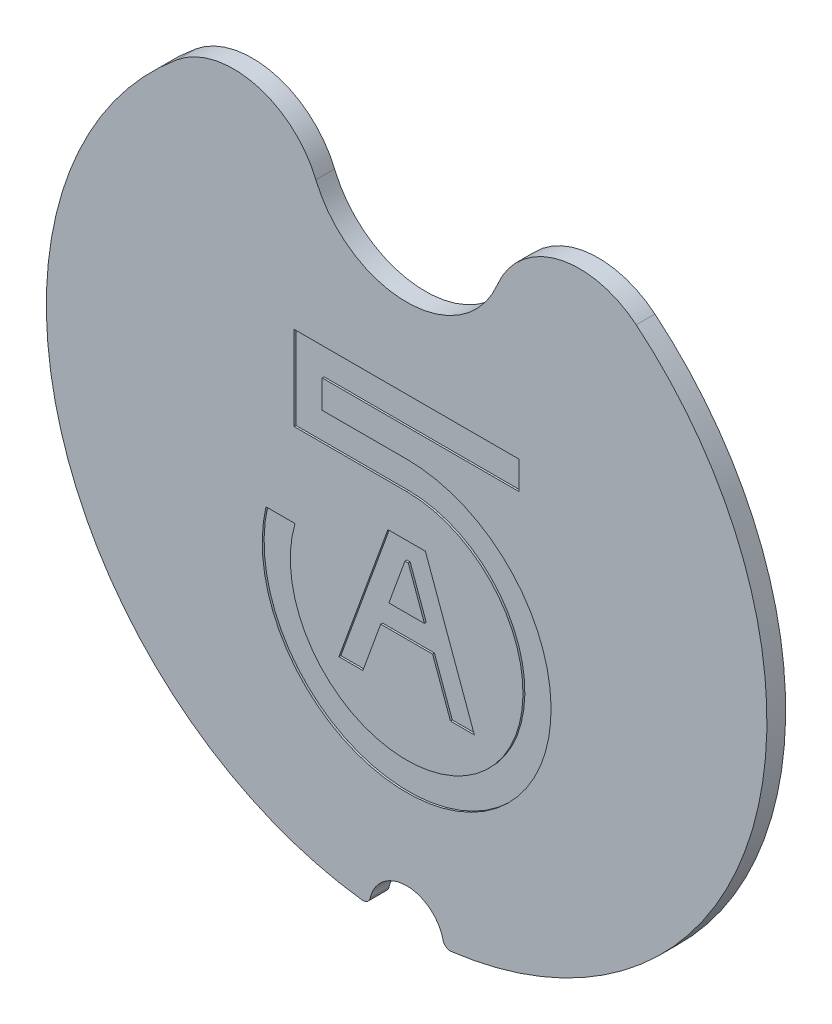
ISO-10303-21;
HEADER;
FILE_DESCRIPTION(('STEP AP214'),'2;1');
FILE_NAME('part.step','',(''),(''),'','','');
FILE_SCHEMA(('AUTOMOTIVE_DESIGN { 1 0 10303 214 1 1 1 1 }'));
ENDSEC;
DATA;
#1=APPLICATION_CONTEXT('core data for automotive mechanical design processes');
#2=APPLICATION_PROTOCOL_DEFINITION('international standard','automotive_design',2000,#1);
#3=PRODUCT_CONTEXT('',#1,'mechanical');
#4=PRODUCT('Part','Part','',(#3));
#5=PRODUCT_RELATED_PRODUCT_CATEGORY('part','',(#4));
#6=PRODUCT_DEFINITION_FORMATION('','',#4);
#7=PRODUCT_DEFINITION_CONTEXT('part definition',#1,'design');
#8=PRODUCT_DEFINITION('design','',#6,#7);
#9=PRODUCT_DEFINITION_SHAPE('','',#8);
#10=(LENGTH_UNIT() NAMED_UNIT(*) SI_UNIT(.MILLI.,.METRE.));
#11=(NAMED_UNIT(*) PLANE_ANGLE_UNIT() SI_UNIT($,.RADIAN.));
#12=(NAMED_UNIT(*) SI_UNIT($,.STERADIAN.) SOLID_ANGLE_UNIT());
#13=UNCERTAINTY_MEASURE_WITH_UNIT(LENGTH_MEASURE(1.E-05),#10,'distance_accuracy_value','');
#14=(GEOMETRIC_REPRESENTATION_CONTEXT(3) GLOBAL_UNCERTAINTY_ASSIGNED_CONTEXT((#13)) GLOBAL_UNIT_ASSIGNED_CONTEXT((#10,
#11,#12)) REPRESENTATION_CONTEXT('',''));
#15=CARTESIAN_POINT('',(0.,0.,0.));
#16=DIRECTION('',(0.,0.,1.));
#17=DIRECTION('',(1.,0.,0.));
#18=AXIS2_PLACEMENT_3D('',#15,#16,#17);
#19=CARTESIAN_POINT('',(46.1977745676131,55.875,5.));
#20=DIRECTION('',(0.,0.,-1.));
#21=DIRECTION('',(-1.,0.,0.));
#22=AXIS2_PLACEMENT_3D('',#19,#20,#21);
#23=CYLINDRICAL_SURFACE('',#22,23.75);
#24=CARTESIAN_POINT('',(46.1977745676131,55.875,0.));
#25=DIRECTION('',(0.,0.,1.));
#26=DIRECTION('',(1.,0.,0.));
#27=AXIS2_PLACEMENT_3D('',#24,#25,#26);
#28=CIRCLE('',#27,23.75);
#29=CARTESIAN_POINT('',(61.3315283052795,74.1788793103448,0.));
#30=VERTEX_POINT('',#29);
#31=CARTESIAN_POINT('',(24.2538316479969,64.959375,0.));
#32=VERTEX_POINT('',#31);
#33=EDGE_CURVE('E328',#30,#32,#28,.T.);
#34=ORIENTED_EDGE('',*,*,#33,.T.);
#35=DIRECTION('',(0.,0.,-1.));
#36=VECTOR('',#35,1.);
#37=CARTESIAN_POINT('',(24.2538316479969,64.959375,5.));
#38=LINE('',#37,#36);
#39=CARTESIAN_POINT('',(24.2538316479969,64.959375,5.));
#40=VERTEX_POINT('',#39);
#41=EDGE_CURVE('E383',#40,#32,#38,.T.);
#42=ORIENTED_EDGE('',*,*,#41,.F.);
#43=CARTESIAN_POINT('',(46.1977745676131,55.875,5.));
#44=DIRECTION('',(0.,0.,1.));
#45=DIRECTION('',(1.,0.,0.));
#46=AXIS2_PLACEMENT_3D('',#43,#44,#45);
#47=CIRCLE('',#46,23.75);
#48=CARTESIAN_POINT('',(61.3315283052795,74.1788793103448,5.));
#49=VERTEX_POINT('',#48);
#50=EDGE_CURVE('E347',#49,#40,#47,.T.);
#51=ORIENTED_EDGE('',*,*,#50,.F.);
#52=DIRECTION('',(0.,0.,-1.));
#53=VECTOR('',#52,1.);
#54=CARTESIAN_POINT('',(61.3315283052795,74.1788793103448,5.));
#55=LINE('',#54,#53);
#56=EDGE_CURVE('E362',#49,#30,#55,.T.);
#57=ORIENTED_EDGE('',*,*,#56,.T.);
#58=EDGE_LOOP('',(#34,#42,#51,#57));
#59=FACE_BOUND('',#58,.T.);
#60=ADVANCED_FACE('F37',(#59),#23,.T.);
#61=CARTESIAN_POINT('',(0.,75.,5.));
#62=DIRECTION('',(0.,0.,-1.));
#63=DIRECTION('',(-1.,0.,0.));
#64=AXIS2_PLACEMENT_3D('',#61,#62,#63);
#65=CYLINDRICAL_SURFACE('',#64,26.25);
#66=CARTESIAN_POINT('',(0.,75.,0.));
#67=DIRECTION('',(0.,0.,-1.));
#68=DIRECTION('',(1.,0.,0.));
#69=AXIS2_PLACEMENT_3D('',#66,#67,#68);
#70=CIRCLE('',#69,26.25);
#71=CARTESIAN_POINT('',(-24.2538316479969,64.959375,0.));
#72=VERTEX_POINT('',#71);
#73=EDGE_CURVE('E365',#32,#72,#70,.T.);
#74=ORIENTED_EDGE('',*,*,#73,.T.);
#75=DIRECTION('',(0.,0.,-1.));
#76=VECTOR('',#75,1.);
#77=CARTESIAN_POINT('',(-24.2538316479969,64.959375,5.));
#78=LINE('',#77,#76);
#79=CARTESIAN_POINT('',(-24.2538316479969,64.959375,5.));
#80=VERTEX_POINT('',#79);
#81=EDGE_CURVE('E380',#80,#72,#78,.T.);
#82=ORIENTED_EDGE('',*,*,#81,.F.);
#83=CARTESIAN_POINT('',(0.,75.,5.));
#84=DIRECTION('',(0.,0.,-1.));
#85=DIRECTION('',(1.,0.,0.));
#86=AXIS2_PLACEMENT_3D('',#83,#84,#85);
#87=CIRCLE('',#86,26.25);
#88=EDGE_CURVE('E350',#40,#80,#87,.T.);
#89=ORIENTED_EDGE('',*,*,#88,.F.);
#90=ORIENTED_EDGE('',*,*,#41,.T.);
#91=EDGE_LOOP('',(#74,#82,#89,#90));
#92=FACE_BOUND('',#91,.T.);
#93=ADVANCED_FACE('F422',(#92),#65,.F.);
#94=CARTESIAN_POINT('',(-46.1977745676131,55.875,5.));
#95=DIRECTION('',(0.,0.,-1.));
#96=DIRECTION('',(-1.,0.,0.));
#97=AXIS2_PLACEMENT_3D('',#94,#95,#96);
#98=CYLINDRICAL_SURFACE('',#97,23.75);
#99=CARTESIAN_POINT('',(-46.1977745676131,55.875,0.));
#100=DIRECTION('',(0.,0.,1.));
#101=DIRECTION('',(1.,0.,0.));
#102=AXIS2_PLACEMENT_3D('',#99,#100,#101);
#103=CIRCLE('',#102,23.75);
#104=CARTESIAN_POINT('',(-61.3315283052795,74.1788793103448,0.));
#105=VERTEX_POINT('',#104);
#106=EDGE_CURVE('E367',#72,#105,#103,.T.);
#107=ORIENTED_EDGE('',*,*,#106,.T.);
#108=DIRECTION('',(0.,0.,-1.));
#109=VECTOR('',#108,1.);
#110=CARTESIAN_POINT('',(-61.3315283052795,74.1788793103448,5.));
#111=LINE('',#110,#109);
#112=CARTESIAN_POINT('',(-61.3315283052795,74.1788793103448,5.));
#113=VERTEX_POINT('',#112);
#114=EDGE_CURVE('E377',#113,#105,#111,.T.);
#115=ORIENTED_EDGE('',*,*,#114,.F.);
#116=CARTESIAN_POINT('',(-46.1977745676131,55.875,5.));
#117=DIRECTION('',(0.,0.,1.));
#118=DIRECTION('',(1.,0.,0.));
#119=AXIS2_PLACEMENT_3D('',#116,#117,#118);
#120=CIRCLE('',#119,23.75);
#121=EDGE_CURVE('E353',#80,#113,#120,.T.);
#122=ORIENTED_EDGE('',*,*,#121,.F.);
#123=ORIENTED_EDGE('',*,*,#81,.T.);
#124=EDGE_LOOP('',(#107,#115,#122,#123));
#125=FACE_BOUND('',#124,.T.);
#126=ADVANCED_FACE('F427',(#125),#98,.T.);
#127=CARTESIAN_POINT('',(0.,0.,5.));
#128=DIRECTION('',(0.,0.,-1.));
#129=DIRECTION('',(-1.,0.,0.));
#130=AXIS2_PLACEMENT_3D('',#127,#128,#129);
#131=CYLINDRICAL_SURFACE('',#130,96.25);
#132=CARTESIAN_POINT('',(0.,0.,0.));
#133=DIRECTION('',(0.,0.,1.));
#134=DIRECTION('',(1.,0.,0.));
#135=AXIS2_PLACEMENT_3D('',#132,#133,#134);
#136=CIRCLE('',#135,96.25);
#137=CARTESIAN_POINT('',(-11.9339520158674,-95.5072944297082,0.));
#138=VERTEX_POINT('',#137);
#139=EDGE_CURVE('E369',#105,#138,#136,.T.);
#140=ORIENTED_EDGE('',*,*,#139,.T.);
#141=DIRECTION('',(0.,0.,-1.));
#142=VECTOR('',#141,1.);
#143=CARTESIAN_POINT('',(-11.9339520158674,-95.5072944297083,5.));
#144=LINE('',#143,#142);
#145=CARTESIAN_POINT('',(-11.9339520158674,-95.5072944297082,5.));
#146=VERTEX_POINT('',#145);
#147=EDGE_CURVE('E391',#138,#146,#144,.F.);
#148=ORIENTED_EDGE('',*,*,#147,.T.);
#149=CARTESIAN_POINT('',(0.,0.,5.));
#150=DIRECTION('',(0.,0.,1.));
#151=DIRECTION('',(1.,0.,0.));
#152=AXIS2_PLACEMENT_3D('',#149,#150,#151);
#153=CIRCLE('',#152,96.25);
#154=EDGE_CURVE('E355',#113,#146,#153,.T.);
#155=ORIENTED_EDGE('',*,*,#154,.F.);
#156=ORIENTED_EDGE('',*,*,#114,.T.);
#157=EDGE_LOOP('',(#140,#148,#155,#156));
#158=FACE_BOUND('',#157,.T.);
#159=ADVANCED_FACE('F433',(#158),#131,.T.);
#160=CARTESIAN_POINT('',(0.,-96.25,5.));
#161=DIRECTION('',(0.,0.,-1.));
#162=DIRECTION('',(-1.,0.,0.));
#163=AXIS2_PLACEMENT_3D('',#160,#161,#162);
#164=CYLINDRICAL_SURFACE('',#163,9.99999999999999);
#165=CARTESIAN_POINT('',(0.,-96.25,0.));
#166=DIRECTION('',(0.,0.,-1.));
#167=DIRECTION('',(1.,0.,0.));
#168=AXIS2_PLACEMENT_3D('',#165,#166,#167);
#169=CIRCLE('',#168,9.99999999999999);
#170=CARTESIAN_POINT('',(-9.73831149346754,-93.9772727272727,0.));
#171=VERTEX_POINT('',#170);
#172=CARTESIAN_POINT('',(9.73831149346751,-93.9772727272727,0.));
#173=VERTEX_POINT('',#172);
#174=EDGE_CURVE('E372',#171,#173,#169,.T.);
#175=ORIENTED_EDGE('',*,*,#174,.T.);
#176=DIRECTION('',(0.,0.,-1.));
#177=VECTOR('',#176,1.);
#178=CARTESIAN_POINT('',(9.73831149346751,-93.9772727272727,5.));
#179=LINE('',#178,#177);
#180=CARTESIAN_POINT('',(9.73831149346751,-93.9772727272727,5.));
#181=VERTEX_POINT('',#180);
#182=EDGE_CURVE('E45',#173,#181,#179,.F.);
#183=ORIENTED_EDGE('',*,*,#182,.T.);
#184=CARTESIAN_POINT('',(0.,-96.25,5.));
#185=DIRECTION('',(0.,0.,-1.));
#186=DIRECTION('',(1.,0.,0.));
#187=AXIS2_PLACEMENT_3D('',#184,#185,#186);
#188=CIRCLE('',#187,9.99999999999999);
#189=CARTESIAN_POINT('',(-9.73831149346754,-93.9772727272727,5.));
#190=VERTEX_POINT('',#189);
#191=EDGE_CURVE('E358',#190,#181,#188,.T.);
#192=ORIENTED_EDGE('',*,*,#191,.F.);
#193=DIRECTION('',(0.,0.,-1.));
#194=VECTOR('',#193,1.);
#195=CARTESIAN_POINT('',(-9.73831149346754,-93.9772727272727,5.));
#196=LINE('',#195,#194);
#197=EDGE_CURVE('E386',#190,#171,#196,.T.);
#198=ORIENTED_EDGE('',*,*,#197,.T.);
#199=EDGE_LOOP('',(#175,#183,#192,#198));
#200=FACE_BOUND('',#199,.T.);
#201=ADVANCED_FACE('F437',(#200),#164,.F.);
#202=CARTESIAN_POINT('',(0.,0.,5.));
#203=DIRECTION('',(0.,0.,-1.));
#204=DIRECTION('',(-1.,0.,0.));
#205=AXIS2_PLACEMENT_3D('',#202,#203,#204);
#206=CYLINDRICAL_SURFACE('',#205,96.25);
#207=CARTESIAN_POINT('',(0.,0.,5.));
#208=DIRECTION('',(0.,0.,1.));
#209=DIRECTION('',(1.,0.,0.));
#210=AXIS2_PLACEMENT_3D('',#207,#208,#209);
#211=CIRCLE('',#210,96.25);
#212=CARTESIAN_POINT('',(11.9339520158674,-95.5072944297082,5.));
#213=VERTEX_POINT('',#212);
#214=EDGE_CURVE('E360',#213,#49,#211,.T.);
#215=ORIENTED_EDGE('',*,*,#214,.F.);
#216=DIRECTION('',(0.,0.,-1.));
#217=VECTOR('',#216,1.);
#218=CARTESIAN_POINT('',(11.9339520158674,-95.5072944297082,5.));
#219=LINE('',#218,#217);
#220=CARTESIAN_POINT('',(11.9339520158674,-95.5072944297082,0.));
#221=VERTEX_POINT('',#220);
#222=EDGE_CURVE('E395',#213,#221,#219,.T.);
#223=ORIENTED_EDGE('',*,*,#222,.T.);
#224=CARTESIAN_POINT('',(0.,0.,0.));
#225=DIRECTION('',(0.,0.,1.));
#226=DIRECTION('',(1.,0.,0.));
#227=AXIS2_PLACEMENT_3D('',#224,#225,#226);
#228=CIRCLE('',#227,96.25);
#229=EDGE_CURVE('E351',#221,#30,#228,.T.);
#230=ORIENTED_EDGE('',*,*,#229,.T.);
#231=ORIENTED_EDGE('',*,*,#56,.F.);
#232=EDGE_LOOP('',(#215,#223,#230,#231));
#233=FACE_BOUND('',#232,.T.);
#234=ADVANCED_FACE('F401',(#233),#206,.T.);
#235=CARTESIAN_POINT('',(23.0988872838066,65.4375,5.));
#236=DIRECTION('',(0.,0.,1.));
#237=DIRECTION('',(1.,0.,0.));
#238=AXIS2_PLACEMENT_3D('',#235,#236,#237);
#239=PLANE('',#238);
#240=DIRECTION('',(-0.342020143325672,-0.939692620785907,0.));
#241=VECTOR('',#240,1.);
#242=CARTESIAN_POINT('',(-5.00000000000001,-6.35531276771627,5.));
#243=LINE('',#242,#241);
#244=CARTESIAN_POINT('',(-5.00000000000001,-6.35531276771627,5.));
#245=VERTEX_POINT('',#244);
#246=CARTESIAN_POINT('',(-18.0837849605956,-42.3027165079522,5.));
#247=VERTEX_POINT('',#246);
#248=EDGE_CURVE('E540',#245,#247,#243,.T.);
#249=ORIENTED_EDGE('',*,*,#248,.F.);
#250=DIRECTION('',(-1.,0.,0.));
#251=VECTOR('',#250,1.);
#252=CARTESIAN_POINT('',(-5.00000000000001,-6.35531276771627,5.));
#253=LINE('',#252,#251);
#254=CARTESIAN_POINT('',(4.99999999999999,-6.35531276771627,5.));
#255=VERTEX_POINT('',#254);
#256=EDGE_CURVE('E589',#255,#245,#253,.T.);
#257=ORIENTED_EDGE('',*,*,#256,.F.);
#258=DIRECTION('',(-0.342020143325672,0.939692620785907,0.));
#259=VECTOR('',#258,1.);
#260=CARTESIAN_POINT('',(4.99999999999999,-6.35531276771627,5.));
#261=LINE('',#260,#259);
#262=CARTESIAN_POINT('',(18.0837849605956,-42.3027165079522,5.));
#263=VERTEX_POINT('',#262);
#264=EDGE_CURVE('E877',#263,#255,#261,.T.);
#265=ORIENTED_EDGE('',*,*,#264,.F.);
#266=DIRECTION('',(1.,0.,0.));
#267=VECTOR('',#266,1.);
#268=CARTESIAN_POINT('',(18.0837849605956,-42.3027165079522,5.));
#269=LINE('',#268,#267);
#270=CARTESIAN_POINT('',(11.6987183257401,-42.3027165079522,5.));
#271=VERTEX_POINT('',#270);
#272=EDGE_CURVE('E880',#271,#263,#269,.T.);
#273=ORIENTED_EDGE('',*,*,#272,.F.);
#274=DIRECTION('',(0.342020143325674,-0.939692620785907,0.));
#275=VECTOR('',#274,1.);
#276=CARTESIAN_POINT('',(11.6987183257401,-42.3027165079522,5.));
#277=LINE('',#276,#275);
#278=CARTESIAN_POINT('',(6.92852647245066,-29.1967221045732,5.));
#279=VERTEX_POINT('',#278);
#280=EDGE_CURVE('E887',#279,#271,#277,.T.);
#281=ORIENTED_EDGE('',*,*,#280,.F.);
#282=DIRECTION('',(1.,0.,0.));
#283=VECTOR('',#282,1.);
#284=CARTESIAN_POINT('',(-6.92852647245068,-29.1967221045732,5.));
#285=LINE('',#284,#283);
#286=CARTESIAN_POINT('',(-6.92852647245068,-29.1967221045732,5.));
#287=VERTEX_POINT('',#286);
#288=EDGE_CURVE('E565',#287,#279,#285,.T.);
#289=ORIENTED_EDGE('',*,*,#288,.F.);
#290=DIRECTION('',(0.342020143325672,0.939692620785907,0.));
#291=VECTOR('',#290,1.);
#292=CARTESIAN_POINT('',(-11.6987183257401,-42.3027165079522,5.));
#293=LINE('',#292,#291);
#294=CARTESIAN_POINT('',(-11.6987183257401,-42.3027165079522,5.));
#295=VERTEX_POINT('',#294);
#296=EDGE_CURVE('E563',#295,#287,#293,.T.);
#297=ORIENTED_EDGE('',*,*,#296,.F.);
#298=DIRECTION('',(1.,0.,0.));
#299=VECTOR('',#298,1.);
#300=CARTESIAN_POINT('',(-18.0837849605956,-42.3027165079522,5.));
#301=LINE('',#300,#299);
#302=EDGE_CURVE('E550',#247,#295,#301,.T.);
#303=ORIENTED_EDGE('',*,*,#302,.F.);
#304=EDGE_LOOP('',(#249,#257,#265,#273,#281,#289,#297,#303));
#305=FACE_BOUND('',#304,.T.);
#306=DIRECTION('',(0.,1.,0.));
#307=VECTOR('',#306,1.);
#308=CARTESIAN_POINT('',(30.0605601779389,27.4545081535052,5.));
#309=LINE('',#308,#307);
#310=CARTESIAN_POINT('',(30.0605601779389,19.9545081535052,5.));
#311=VERTEX_POINT('',#310);
#312=CARTESIAN_POINT('',(30.0605601779389,27.4545081535052,5.));
#313=VERTEX_POINT('',#312);
#314=EDGE_CURVE('E297',#311,#313,#309,.T.);
#315=ORIENTED_EDGE('',*,*,#314,.F.);
#316=DIRECTION('',(1.,0.,0.));
#317=VECTOR('',#316,1.);
#318=CARTESIAN_POINT('',(30.0605601779389,19.9545081535052,5.));
#319=LINE('',#318,#317);
#320=CARTESIAN_POINT('',(-22.5605601779389,19.9545081535052,5.));
#321=VERTEX_POINT('',#320);
#322=EDGE_CURVE('E269',#321,#311,#319,.T.);
#323=ORIENTED_EDGE('',*,*,#322,.F.);
#324=DIRECTION('',(0.,1.,0.));
#325=VECTOR('',#324,1.);
#326=CARTESIAN_POINT('',(-22.5605601779389,19.9545081535052,5.));
#327=LINE('',#326,#325);
#328=CARTESIAN_POINT('',(-22.5605601779389,12.4545081535052,5.));
#329=VERTEX_POINT('',#328);
#330=EDGE_CURVE('E321',#329,#321,#327,.T.);
#331=ORIENTED_EDGE('',*,*,#330,.F.);
#332=DIRECTION('',(-1.,0.,0.));
#333=VECTOR('',#332,1.);
#334=CARTESIAN_POINT('',(-22.5605601779389,12.4545081535052,5.));
#335=LINE('',#334,#333);
#336=CARTESIAN_POINT('',(0.,12.4545081535052,5.));
#337=VERTEX_POINT('',#336);
#338=EDGE_CURVE('E318',#337,#329,#335,.T.);
#339=ORIENTED_EDGE('',*,*,#338,.F.);
#340=CARTESIAN_POINT('',(0.,-26.1251014973369,5.));
#341=DIRECTION('',(0.,0.,1.));
#342=DIRECTION('',(-1.,0.,0.));
#343=AXIS2_PLACEMENT_3D('',#340,#341,#342);
#344=CIRCLE('',#343,38.5796096508421);
#345=CARTESIAN_POINT('',(-37.5718466988546,-17.3648151750118,5.));
#346=VERTEX_POINT('',#345);
#347=EDGE_CURVE('E315',#346,#337,#344,.T.);
#348=ORIENTED_EDGE('',*,*,#347,.F.);
#349=DIRECTION('',(-1.,0.,0.));
#350=VECTOR('',#349,1.);
#351=CARTESIAN_POINT('',(-37.5718466988546,-17.3648151750118,5.));
#352=LINE('',#351,#350);
#353=CARTESIAN_POINT('',(-29.8194486803428,-17.3648151750118,5.));
#354=VERTEX_POINT('',#353);
#355=EDGE_CURVE('E312',#354,#346,#352,.T.);
#356=ORIENTED_EDGE('',*,*,#355,.F.);
#357=CARTESIAN_POINT('',(0.,-26.1251014973369,5.));
#358=DIRECTION('',(0.,0.,-1.));
#359=DIRECTION('',(1.,0.,0.));
#360=AXIS2_PLACEMENT_3D('',#357,#358,#359);
#361=CIRCLE('',#360,31.0796096508421);
#362=CARTESIAN_POINT('',(0.,4.95450815350518,5.));
#363=VERTEX_POINT('',#362);
#364=EDGE_CURVE('E309',#363,#354,#361,.T.);
#365=ORIENTED_EDGE('',*,*,#364,.F.);
#366=DIRECTION('',(1.,0.,0.));
#367=VECTOR('',#366,1.);
#368=CARTESIAN_POINT('',(0.,4.95450815350518,5.));
#369=LINE('',#368,#367);
#370=CARTESIAN_POINT('',(-30.0605601779389,4.95450815350517,5.));
#371=VERTEX_POINT('',#370);
#372=EDGE_CURVE('E306',#371,#363,#369,.T.);
#373=ORIENTED_EDGE('',*,*,#372,.F.);
#374=DIRECTION('',(0.,-1.,0.));
#375=VECTOR('',#374,1.);
#376=CARTESIAN_POINT('',(-30.0605601779389,27.4545081535052,5.));
#377=LINE('',#376,#375);
#378=CARTESIAN_POINT('',(-30.0605601779389,27.4545081535052,5.));
#379=VERTEX_POINT('',#378);
#380=EDGE_CURVE('E303',#379,#371,#377,.T.);
#381=ORIENTED_EDGE('',*,*,#380,.F.);
#382=DIRECTION('',(-1.,0.,0.));
#383=VECTOR('',#382,1.);
#384=CARTESIAN_POINT('',(30.0605601779389,27.4545081535052,5.));
#385=LINE('',#384,#383);
#386=EDGE_CURVE('E299',#313,#379,#385,.T.);
#387=ORIENTED_EDGE('',*,*,#386,.F.);
#388=EDGE_LOOP('',(#315,#323,#331,#339,#348,#356,#365,#373,#381,#387));
#389=FACE_BOUND('',#388,.T.);
#390=ORIENTED_EDGE('',*,*,#191,.T.);
#391=CARTESIAN_POINT('',(11.6859737921611,-93.5227272727273,5.));
#392=DIRECTION('',(0.,0.,1.));
#393=DIRECTION('',(1.,0.,0.));
#394=AXIS2_PLACEMENT_3D('',#391,#392,#393);
#395=CIRCLE('',#394,2.);
#396=EDGE_CURVE('E11',#181,#213,#395,.T.);
#397=ORIENTED_EDGE('',*,*,#396,.T.);
#398=ORIENTED_EDGE('',*,*,#214,.T.);
#399=ORIENTED_EDGE('',*,*,#50,.T.);
#400=ORIENTED_EDGE('',*,*,#88,.T.);
#401=ORIENTED_EDGE('',*,*,#121,.T.);
#402=ORIENTED_EDGE('',*,*,#154,.T.);
#403=CARTESIAN_POINT('',(-11.685973792161,-93.5227272727273,5.));
#404=DIRECTION('',(0.,0.,1.));
#405=DIRECTION('',(1.,0.,0.));
#406=AXIS2_PLACEMENT_3D('',#403,#404,#405);
#407=CIRCLE('',#406,2.);
#408=EDGE_CURVE('E393',#146,#190,#407,.T.);
#409=ORIENTED_EDGE('',*,*,#408,.T.);
#410=EDGE_LOOP('',(#390,#397,#398,#399,#400,#401,#402,#409));
#411=FACE_BOUND('',#410,.T.);
#412=ADVANCED_FACE('F412',(#305,#389,#411),#239,.T.);
#413=CARTESIAN_POINT('',(23.0988872838066,65.4375,0.));
#414=DIRECTION('',(0.,0.,1.));
#415=DIRECTION('',(1.,0.,0.));
#416=AXIS2_PLACEMENT_3D('',#413,#414,#415);
#417=PLANE('',#416);
#418=ORIENTED_EDGE('',*,*,#229,.F.);
#419=CARTESIAN_POINT('',(11.6859737921611,-93.5227272727273,0.));
#420=DIRECTION('',(0.,0.,1.));
#421=DIRECTION('',(1.,0.,0.));
#422=AXIS2_PLACEMENT_3D('',#419,#420,#421);
#423=CIRCLE('',#422,2.);
#424=EDGE_CURVE('E59',#221,#173,#423,.F.);
#425=ORIENTED_EDGE('',*,*,#424,.T.);
#426=ORIENTED_EDGE('',*,*,#174,.F.);
#427=CARTESIAN_POINT('',(-11.685973792161,-93.5227272727273,0.));
#428=DIRECTION('',(0.,0.,1.));
#429=DIRECTION('',(1.,0.,0.));
#430=AXIS2_PLACEMENT_3D('',#427,#428,#429);
#431=CIRCLE('',#430,2.);
#432=EDGE_CURVE('E389',#171,#138,#431,.F.);
#433=ORIENTED_EDGE('',*,*,#432,.T.);
#434=ORIENTED_EDGE('',*,*,#139,.F.);
#435=ORIENTED_EDGE('',*,*,#106,.F.);
#436=ORIENTED_EDGE('',*,*,#73,.F.);
#437=ORIENTED_EDGE('',*,*,#33,.F.);
#438=EDGE_LOOP('',(#418,#425,#426,#433,#434,#435,#436,#437));
#439=FACE_BOUND('',#438,.T.);
#440=ADVANCED_FACE('F406',(#439),#417,.F.);
#441=CARTESIAN_POINT('',(30.0605601779389,27.4545081535052,4.5));
#442=DIRECTION('',(1.,0.,0.));
#443=DIRECTION('',(0.,1.,0.));
#444=AXIS2_PLACEMENT_3D('',#441,#442,#443);
#445=PLANE('',#444);
#446=ORIENTED_EDGE('',*,*,#314,.T.);
#447=DIRECTION('',(0.,0.,1.));
#448=VECTOR('',#447,1.);
#449=CARTESIAN_POINT('',(30.0605601779389,27.4545081535052,4.5));
#450=LINE('',#449,#448);
#451=CARTESIAN_POINT('',(30.0605601779389,27.4545081535052,4.5));
#452=VERTEX_POINT('',#451);
#453=EDGE_CURVE('E296',#452,#313,#450,.T.);
#454=ORIENTED_EDGE('',*,*,#453,.F.);
#455=DIRECTION('',(0.,1.,0.));
#456=VECTOR('',#455,1.);
#457=CARTESIAN_POINT('',(30.0605601779389,27.4545081535052,4.5));
#458=LINE('',#457,#456);
#459=CARTESIAN_POINT('',(30.0605601779389,19.9545081535052,4.5));
#460=VERTEX_POINT('',#459);
#461=EDGE_CURVE('E265',#460,#452,#458,.T.);
#462=ORIENTED_EDGE('',*,*,#461,.F.);
#463=DIRECTION('',(0.,0.,1.));
#464=VECTOR('',#463,1.);
#465=CARTESIAN_POINT('',(30.0605601779389,19.9545081535052,4.5));
#466=LINE('',#465,#464);
#467=EDGE_CURVE('E326',#460,#311,#466,.T.);
#468=ORIENTED_EDGE('',*,*,#467,.T.);
#469=EDGE_LOOP('',(#446,#454,#462,#468));
#470=FACE_BOUND('',#469,.T.);
#471=ADVANCED_FACE('F445',(#470),#445,.F.);
#472=CARTESIAN_POINT('',(30.0605601779389,19.9545081535052,4.5));
#473=DIRECTION('',(0.,-1.,0.));
#474=DIRECTION('',(1.,0.,0.));
#475=AXIS2_PLACEMENT_3D('',#472,#473,#474);
#476=PLANE('',#475);
#477=ORIENTED_EDGE('',*,*,#322,.T.);
#478=ORIENTED_EDGE('',*,*,#467,.F.);
#479=DIRECTION('',(1.,0.,0.));
#480=VECTOR('',#479,1.);
#481=CARTESIAN_POINT('',(30.0605601779389,19.9545081535052,4.5));
#482=LINE('',#481,#480);
#483=CARTESIAN_POINT('',(-22.5605601779389,19.9545081535052,4.5));
#484=VERTEX_POINT('',#483);
#485=EDGE_CURVE('E293',#484,#460,#482,.T.);
#486=ORIENTED_EDGE('',*,*,#485,.F.);
#487=DIRECTION('',(0.,0.,1.));
#488=VECTOR('',#487,1.);
#489=CARTESIAN_POINT('',(-22.5605601779389,19.9545081535052,4.5));
#490=LINE('',#489,#488);
#491=EDGE_CURVE('E329',#484,#321,#490,.T.);
#492=ORIENTED_EDGE('',*,*,#491,.T.);
#493=EDGE_LOOP('',(#477,#478,#486,#492));
#494=FACE_BOUND('',#493,.T.);
#495=ADVANCED_FACE('F451',(#494),#476,.F.);
#496=CARTESIAN_POINT('',(-22.5605601779389,19.9545081535052,4.5));
#497=DIRECTION('',(1.,0.,0.));
#498=DIRECTION('',(0.,0.,-1.));
#499=AXIS2_PLACEMENT_3D('',#496,#497,#498);
#500=PLANE('',#499);
#501=ORIENTED_EDGE('',*,*,#330,.T.);
#502=ORIENTED_EDGE('',*,*,#491,.F.);
#503=DIRECTION('',(0.,1.,0.));
#504=VECTOR('',#503,1.);
#505=CARTESIAN_POINT('',(-22.5605601779389,19.9545081535052,4.5));
#506=LINE('',#505,#504);
#507=CARTESIAN_POINT('',(-22.5605601779389,12.4545081535052,4.5));
#508=VERTEX_POINT('',#507);
#509=EDGE_CURVE('E290',#508,#484,#506,.T.);
#510=ORIENTED_EDGE('',*,*,#509,.F.);
#511=DIRECTION('',(0.,0.,1.));
#512=VECTOR('',#511,1.);
#513=CARTESIAN_POINT('',(-22.5605601779389,12.4545081535052,4.5));
#514=LINE('',#513,#512);
#515=EDGE_CURVE('E331',#508,#329,#514,.T.);
#516=ORIENTED_EDGE('',*,*,#515,.T.);
#517=EDGE_LOOP('',(#501,#502,#510,#516));
#518=FACE_BOUND('',#517,.T.);
#519=ADVANCED_FACE('F481',(#518),#500,.F.);
#520=CARTESIAN_POINT('',(-22.5605601779389,12.4545081535052,4.5));
#521=DIRECTION('',(0.,1.,0.));
#522=DIRECTION('',(-1.,0.,0.));
#523=AXIS2_PLACEMENT_3D('',#520,#521,#522);
#524=PLANE('',#523);
#525=ORIENTED_EDGE('',*,*,#338,.T.);
#526=ORIENTED_EDGE('',*,*,#515,.F.);
#527=DIRECTION('',(-1.,0.,0.));
#528=VECTOR('',#527,1.);
#529=CARTESIAN_POINT('',(-22.5605601779389,12.4545081535052,4.5));
#530=LINE('',#529,#528);
#531=CARTESIAN_POINT('',(0.,12.4545081535052,4.5));
#532=VERTEX_POINT('',#531);
#533=EDGE_CURVE('E287',#532,#508,#530,.T.);
#534=ORIENTED_EDGE('',*,*,#533,.F.);
#535=DIRECTION('',(0.,0.,1.));
#536=VECTOR('',#535,1.);
#537=CARTESIAN_POINT('',(0.,12.4545081535052,4.5));
#538=LINE('',#537,#536);
#539=EDGE_CURVE('E333',#532,#337,#538,.T.);
#540=ORIENTED_EDGE('',*,*,#539,.T.);
#541=EDGE_LOOP('',(#525,#526,#534,#540));
#542=FACE_BOUND('',#541,.T.);
#543=ADVANCED_FACE('F477',(#542),#524,.F.);
#544=CARTESIAN_POINT('',(0.,-26.1251014973369,4.5));
#545=DIRECTION('',(0.,0.,1.));
#546=DIRECTION('',(1.,0.,0.));
#547=AXIS2_PLACEMENT_3D('',#544,#545,#546);
#548=CYLINDRICAL_SURFACE('',#547,38.5796096508421);
#549=ORIENTED_EDGE('',*,*,#347,.T.);
#550=ORIENTED_EDGE('',*,*,#539,.F.);
#551=CARTESIAN_POINT('',(0.,-26.1251014973369,4.5));
#552=DIRECTION('',(0.,0.,1.));
#553=DIRECTION('',(-1.,0.,0.));
#554=AXIS2_PLACEMENT_3D('',#551,#552,#553);
#555=CIRCLE('',#554,38.5796096508421);
#556=CARTESIAN_POINT('',(-37.5718466988546,-17.3648151750118,4.5));
#557=VERTEX_POINT('',#556);
#558=EDGE_CURVE('E284',#557,#532,#555,.T.);
#559=ORIENTED_EDGE('',*,*,#558,.F.);
#560=DIRECTION('',(0.,0.,1.));
#561=VECTOR('',#560,1.);
#562=CARTESIAN_POINT('',(-37.5718466988546,-17.3648151750118,4.5));
#563=LINE('',#562,#561);
#564=EDGE_CURVE('E335',#557,#346,#563,.T.);
#565=ORIENTED_EDGE('',*,*,#564,.T.);
#566=EDGE_LOOP('',(#549,#550,#559,#565));
#567=FACE_BOUND('',#566,.T.);
#568=ADVANCED_FACE('F473',(#567),#548,.F.);
#569=CARTESIAN_POINT('',(-37.5718466988546,-17.3648151750118,4.5));
#570=DIRECTION('',(0.,1.,0.));
#571=DIRECTION('',(0.,0.,1.));
#572=AXIS2_PLACEMENT_3D('',#569,#570,#571);
#573=PLANE('',#572);
#574=ORIENTED_EDGE('',*,*,#355,.T.);
#575=ORIENTED_EDGE('',*,*,#564,.F.);
#576=DIRECTION('',(-1.,0.,0.));
#577=VECTOR('',#576,1.);
#578=CARTESIAN_POINT('',(-37.5718466988546,-17.3648151750118,4.5));
#579=LINE('',#578,#577);
#580=CARTESIAN_POINT('',(-29.8194486803428,-17.3648151750118,4.5));
#581=VERTEX_POINT('',#580);
#582=EDGE_CURVE('E281',#581,#557,#579,.T.);
#583=ORIENTED_EDGE('',*,*,#582,.F.);
#584=DIRECTION('',(0.,0.,1.));
#585=VECTOR('',#584,1.);
#586=CARTESIAN_POINT('',(-29.8194486803428,-17.3648151750118,4.5));
#587=LINE('',#586,#585);
#588=EDGE_CURVE('E337',#581,#354,#587,.T.);
#589=ORIENTED_EDGE('',*,*,#588,.T.);
#590=EDGE_LOOP('',(#574,#575,#583,#589));
#591=FACE_BOUND('',#590,.T.);
#592=ADVANCED_FACE('F469',(#591),#573,.F.);
#593=CARTESIAN_POINT('',(0.,-26.1251014973369,4.5));
#594=DIRECTION('',(0.,0.,1.));
#595=DIRECTION('',(1.,0.,0.));
#596=AXIS2_PLACEMENT_3D('',#593,#594,#595);
#597=CYLINDRICAL_SURFACE('',#596,31.0796096508421);
#598=ORIENTED_EDGE('',*,*,#364,.T.);
#599=ORIENTED_EDGE('',*,*,#588,.F.);
#600=CARTESIAN_POINT('',(0.,-26.1251014973369,4.5));
#601=DIRECTION('',(0.,0.,-1.));
#602=DIRECTION('',(1.,0.,0.));
#603=AXIS2_PLACEMENT_3D('',#600,#601,#602);
#604=CIRCLE('',#603,31.0796096508421);
#605=CARTESIAN_POINT('',(0.,4.95450815350518,4.5));
#606=VERTEX_POINT('',#605);
#607=EDGE_CURVE('E278',#606,#581,#604,.T.);
#608=ORIENTED_EDGE('',*,*,#607,.F.);
#609=DIRECTION('',(0.,0.,1.));
#610=VECTOR('',#609,1.);
#611=CARTESIAN_POINT('',(0.,4.95450815350518,4.5));
#612=LINE('',#611,#610);
#613=EDGE_CURVE('E339',#606,#363,#612,.T.);
#614=ORIENTED_EDGE('',*,*,#613,.T.);
#615=EDGE_LOOP('',(#598,#599,#608,#614));
#616=FACE_BOUND('',#615,.T.);
#617=ADVANCED_FACE('F465',(#616),#597,.T.);
#618=CARTESIAN_POINT('',(0.,4.95450815350518,4.5));
#619=DIRECTION('',(0.,-1.,0.));
#620=DIRECTION('',(1.,0.,0.));
#621=AXIS2_PLACEMENT_3D('',#618,#619,#620);
#622=PLANE('',#621);
#623=ORIENTED_EDGE('',*,*,#372,.T.);
#624=ORIENTED_EDGE('',*,*,#613,.F.);
#625=DIRECTION('',(1.,0.,0.));
#626=VECTOR('',#625,1.);
#627=CARTESIAN_POINT('',(0.,4.95450815350518,4.5));
#628=LINE('',#627,#626);
#629=CARTESIAN_POINT('',(-30.0605601779389,4.95450815350517,4.5));
#630=VERTEX_POINT('',#629);
#631=EDGE_CURVE('E275',#630,#606,#628,.T.);
#632=ORIENTED_EDGE('',*,*,#631,.F.);
#633=DIRECTION('',(0.,0.,1.));
#634=VECTOR('',#633,1.);
#635=CARTESIAN_POINT('',(-30.0605601779389,4.95450815350517,4.5));
#636=LINE('',#635,#634);
#637=EDGE_CURVE('E341',#630,#371,#636,.T.);
#638=ORIENTED_EDGE('',*,*,#637,.T.);
#639=EDGE_LOOP('',(#623,#624,#632,#638));
#640=FACE_BOUND('',#639,.T.);
#641=ADVANCED_FACE('F461',(#640),#622,.F.);
#642=CARTESIAN_POINT('',(-30.0605601779389,27.4545081535052,4.5));
#643=DIRECTION('',(-1.,0.,0.));
#644=DIRECTION('',(0.,-1.,0.));
#645=AXIS2_PLACEMENT_3D('',#642,#643,#644);
#646=PLANE('',#645);
#647=ORIENTED_EDGE('',*,*,#380,.T.);
#648=ORIENTED_EDGE('',*,*,#637,.F.);
#649=DIRECTION('',(0.,-1.,0.));
#650=VECTOR('',#649,1.);
#651=CARTESIAN_POINT('',(-30.0605601779389,27.4545081535052,4.5));
#652=LINE('',#651,#650);
#653=CARTESIAN_POINT('',(-30.0605601779389,27.4545081535052,4.5));
#654=VERTEX_POINT('',#653);
#655=EDGE_CURVE('E272',#654,#630,#652,.T.);
#656=ORIENTED_EDGE('',*,*,#655,.F.);
#657=DIRECTION('',(0.,0.,1.));
#658=VECTOR('',#657,1.);
#659=CARTESIAN_POINT('',(-30.0605601779389,27.4545081535052,4.5));
#660=LINE('',#659,#658);
#661=EDGE_CURVE('E343',#654,#379,#660,.T.);
#662=ORIENTED_EDGE('',*,*,#661,.T.);
#663=EDGE_LOOP('',(#647,#648,#656,#662));
#664=FACE_BOUND('',#663,.T.);
#665=ADVANCED_FACE('F457',(#664),#646,.F.);
#666=CARTESIAN_POINT('',(30.0605601779389,27.4545081535052,4.5));
#667=DIRECTION('',(0.,1.,0.));
#668=DIRECTION('',(0.,0.,1.));
#669=AXIS2_PLACEMENT_3D('',#666,#667,#668);
#670=PLANE('',#669);
#671=ORIENTED_EDGE('',*,*,#386,.T.);
#672=ORIENTED_EDGE('',*,*,#661,.F.);
#673=DIRECTION('',(-1.,0.,0.));
#674=VECTOR('',#673,1.);
#675=CARTESIAN_POINT('',(30.0605601779389,27.4545081535052,4.5));
#676=LINE('',#675,#674);
#677=EDGE_CURVE('E268',#452,#654,#676,.T.);
#678=ORIENTED_EDGE('',*,*,#677,.F.);
#679=ORIENTED_EDGE('',*,*,#453,.T.);
#680=EDGE_LOOP('',(#671,#672,#678,#679));
#681=FACE_BOUND('',#680,.T.);
#682=ADVANCED_FACE('F453',(#681),#670,.F.);
#683=CARTESIAN_POINT('',(0.,-26.1251014973369,4.5));
#684=DIRECTION('',(0.,0.,-1.));
#685=DIRECTION('',(-1.,0.,0.));
#686=AXIS2_PLACEMENT_3D('',#683,#684,#685);
#687=PLANE('',#686);
#688=ORIENTED_EDGE('',*,*,#461,.T.);
#689=ORIENTED_EDGE('',*,*,#677,.T.);
#690=ORIENTED_EDGE('',*,*,#655,.T.);
#691=ORIENTED_EDGE('',*,*,#631,.T.);
#692=ORIENTED_EDGE('',*,*,#607,.T.);
#693=ORIENTED_EDGE('',*,*,#582,.T.);
#694=ORIENTED_EDGE('',*,*,#558,.T.);
#695=ORIENTED_EDGE('',*,*,#533,.T.);
#696=ORIENTED_EDGE('',*,*,#509,.T.);
#697=ORIENTED_EDGE('',*,*,#485,.T.);
#698=EDGE_LOOP('',(#688,#689,#690,#691,#692,#693,#694,#695,#696,#697));
#699=FACE_BOUND('',#698,.T.);
#700=ADVANCED_FACE('F456',(#699),#687,.F.);
#701=CARTESIAN_POINT('',(-5.00000000000001,-6.35531276771627,4.5));
#702=DIRECTION('',(-0.939692620785907,0.342020143325672,0.));
#703=DIRECTION('',(-0.342020143325672,-0.939692620785907,0.));
#704=AXIS2_PLACEMENT_3D('',#701,#702,#703);
#705=PLANE('',#704);
#706=ORIENTED_EDGE('',*,*,#248,.T.);
#707=DIRECTION('',(0.,0.,1.));
#708=VECTOR('',#707,1.);
#709=CARTESIAN_POINT('',(-18.0837849605956,-42.3027165079522,4.5));
#710=LINE('',#709,#708);
#711=CARTESIAN_POINT('',(-18.0837849605956,-42.3027165079522,4.5));
#712=VERTEX_POINT('',#711);
#713=EDGE_CURVE('E543',#712,#247,#710,.T.);
#714=ORIENTED_EDGE('',*,*,#713,.F.);
#715=DIRECTION('',(-0.342020143325672,-0.939692620785907,0.));
#716=VECTOR('',#715,1.);
#717=CARTESIAN_POINT('',(-5.00000000000001,-6.35531276771627,4.5));
#718=LINE('',#717,#716);
#719=CARTESIAN_POINT('',(-5.00000000000001,-6.35531276771627,4.5));
#720=VERTEX_POINT('',#719);
#721=EDGE_CURVE('E587',#720,#712,#718,.T.);
#722=ORIENTED_EDGE('',*,*,#721,.F.);
#723=DIRECTION('',(0.,0.,1.));
#724=VECTOR('',#723,1.);
#725=CARTESIAN_POINT('',(-5.00000000000001,-6.35531276771627,4.5));
#726=LINE('',#725,#724);
#727=EDGE_CURVE('E545',#720,#245,#726,.T.);
#728=ORIENTED_EDGE('',*,*,#727,.T.);
#729=EDGE_LOOP('',(#706,#714,#722,#728));
#730=FACE_BOUND('',#729,.T.);
#731=ADVANCED_FACE('F491',(#730),#705,.F.);
#732=CARTESIAN_POINT('',(-5.00000000000001,-6.35531276771627,4.5));
#733=DIRECTION('',(0.,1.,0.));
#734=DIRECTION('',(0.,0.,1.));
#735=AXIS2_PLACEMENT_3D('',#732,#733,#734);
#736=PLANE('',#735);
#737=ORIENTED_EDGE('',*,*,#256,.T.);
#738=ORIENTED_EDGE('',*,*,#727,.F.);
#739=DIRECTION('',(-1.,0.,0.));
#740=VECTOR('',#739,1.);
#741=CARTESIAN_POINT('',(-5.00000000000001,-6.35531276771627,4.5));
#742=LINE('',#741,#740);
#743=CARTESIAN_POINT('',(4.99999999999999,-6.35531276771627,4.5));
#744=VERTEX_POINT('',#743);
#745=EDGE_CURVE('E557',#744,#720,#742,.T.);
#746=ORIENTED_EDGE('',*,*,#745,.F.);
#747=DIRECTION('',(0.,0.,1.));
#748=VECTOR('',#747,1.);
#749=CARTESIAN_POINT('',(4.99999999999999,-6.35531276771627,4.5));
#750=LINE('',#749,#748);
#751=EDGE_CURVE('E905',#744,#255,#750,.T.);
#752=ORIENTED_EDGE('',*,*,#751,.T.);
#753=EDGE_LOOP('',(#737,#738,#746,#752));
#754=FACE_BOUND('',#753,.T.);
#755=ADVANCED_FACE('F508',(#754),#736,.F.);
#756=CARTESIAN_POINT('',(4.99999999999999,-6.35531276771627,4.5));
#757=DIRECTION('',(0.939692620785907,0.342020143325672,0.));
#758=DIRECTION('',(-0.342020143325672,0.939692620785907,0.));
#759=AXIS2_PLACEMENT_3D('',#756,#757,#758);
#760=PLANE('',#759);
#761=ORIENTED_EDGE('',*,*,#264,.T.);
#762=ORIENTED_EDGE('',*,*,#751,.F.);
#763=DIRECTION('',(-0.342020143325672,0.939692620785907,0.));
#764=VECTOR('',#763,1.);
#765=CARTESIAN_POINT('',(4.99999999999999,-6.35531276771627,4.5));
#766=LINE('',#765,#764);
#767=CARTESIAN_POINT('',(18.0837849605956,-42.3027165079522,4.5));
#768=VERTEX_POINT('',#767);
#769=EDGE_CURVE('E571',#768,#744,#766,.T.);
#770=ORIENTED_EDGE('',*,*,#769,.F.);
#771=DIRECTION('',(0.,0.,1.));
#772=VECTOR('',#771,1.);
#773=CARTESIAN_POINT('',(18.0837849605956,-42.3027165079522,4.5));
#774=LINE('',#773,#772);
#775=EDGE_CURVE('E901',#768,#263,#774,.T.);
#776=ORIENTED_EDGE('',*,*,#775,.T.);
#777=EDGE_LOOP('',(#761,#762,#770,#776));
#778=FACE_BOUND('',#777,.T.);
#779=ADVANCED_FACE('F511',(#778),#760,.F.);
#780=CARTESIAN_POINT('',(18.0837849605956,-42.3027165079522,4.5));
#781=DIRECTION('',(0.,-1.,0.));
#782=DIRECTION('',(1.,0.,0.));
#783=AXIS2_PLACEMENT_3D('',#780,#781,#782);
#784=PLANE('',#783);
#785=ORIENTED_EDGE('',*,*,#272,.T.);
#786=ORIENTED_EDGE('',*,*,#775,.F.);
#787=DIRECTION('',(1.,0.,0.));
#788=VECTOR('',#787,1.);
#789=CARTESIAN_POINT('',(18.0837849605956,-42.3027165079522,4.5));
#790=LINE('',#789,#788);
#791=CARTESIAN_POINT('',(11.6987183257401,-42.3027165079522,4.5));
#792=VERTEX_POINT('',#791);
#793=EDGE_CURVE('E574',#792,#768,#790,.T.);
#794=ORIENTED_EDGE('',*,*,#793,.F.);
#795=DIRECTION('',(0.,0.,1.));
#796=VECTOR('',#795,1.);
#797=CARTESIAN_POINT('',(11.6987183257401,-42.3027165079522,4.5));
#798=LINE('',#797,#796);
#799=EDGE_CURVE('E897',#792,#271,#798,.T.);
#800=ORIENTED_EDGE('',*,*,#799,.T.);
#801=EDGE_LOOP('',(#785,#786,#794,#800));
#802=FACE_BOUND('',#801,.T.);
#803=ADVANCED_FACE('F515',(#802),#784,.F.);
#804=CARTESIAN_POINT('',(11.6987183257401,-42.3027165079522,4.5));
#805=DIRECTION('',(-0.939692620785907,-0.342020143325674,0.));
#806=DIRECTION('',(0.342020143325674,-0.939692620785907,0.));
#807=AXIS2_PLACEMENT_3D('',#804,#805,#806);
#808=PLANE('',#807);
#809=ORIENTED_EDGE('',*,*,#280,.T.);
#810=ORIENTED_EDGE('',*,*,#799,.F.);
#811=DIRECTION('',(0.342020143325674,-0.939692620785907,0.));
#812=VECTOR('',#811,1.);
#813=CARTESIAN_POINT('',(11.6987183257401,-42.3027165079522,4.5));
#814=LINE('',#813,#812);
#815=CARTESIAN_POINT('',(6.92852647245066,-29.1967221045732,4.5));
#816=VERTEX_POINT('',#815);
#817=EDGE_CURVE('E577',#816,#792,#814,.T.);
#818=ORIENTED_EDGE('',*,*,#817,.F.);
#819=DIRECTION('',(0.,0.,1.));
#820=VECTOR('',#819,1.);
#821=CARTESIAN_POINT('',(6.92852647245066,-29.1967221045732,4.5));
#822=LINE('',#821,#820);
#823=EDGE_CURVE('E892',#816,#279,#822,.T.);
#824=ORIENTED_EDGE('',*,*,#823,.T.);
#825=EDGE_LOOP('',(#809,#810,#818,#824));
#826=FACE_BOUND('',#825,.T.);
#827=ADVANCED_FACE('F519',(#826),#808,.F.);
#828=CARTESIAN_POINT('',(-6.92852647245068,-29.1967221045732,4.5));
#829=DIRECTION('',(0.,-1.,0.));
#830=DIRECTION('',(0.,0.,-1.));
#831=AXIS2_PLACEMENT_3D('',#828,#829,#830);
#832=PLANE('',#831);
#833=ORIENTED_EDGE('',*,*,#288,.T.);
#834=ORIENTED_EDGE('',*,*,#823,.F.);
#835=DIRECTION('',(1.,0.,0.));
#836=VECTOR('',#835,1.);
#837=CARTESIAN_POINT('',(-6.92852647245068,-29.1967221045732,4.5));
#838=LINE('',#837,#836);
#839=CARTESIAN_POINT('',(-6.92852647245068,-29.1967221045732,4.5));
#840=VERTEX_POINT('',#839);
#841=EDGE_CURVE('E580',#840,#816,#838,.T.);
#842=ORIENTED_EDGE('',*,*,#841,.F.);
#843=DIRECTION('',(0.,0.,1.));
#844=VECTOR('',#843,1.);
#845=CARTESIAN_POINT('',(-6.92852647245068,-29.1967221045732,4.5));
#846=LINE('',#845,#844);
#847=EDGE_CURVE('E894',#840,#287,#846,.T.);
#848=ORIENTED_EDGE('',*,*,#847,.T.);
#849=EDGE_LOOP('',(#833,#834,#842,#848));
#850=FACE_BOUND('',#849,.T.);
#851=ADVANCED_FACE('F523',(#850),#832,.F.);
#852=CARTESIAN_POINT('',(-11.6987183257401,-42.3027165079522,4.5));
#853=DIRECTION('',(0.939692620785907,-0.342020143325672,0.));
#854=DIRECTION('',(0.342020143325672,0.939692620785907,0.));
#855=AXIS2_PLACEMENT_3D('',#852,#853,#854);
#856=PLANE('',#855);
#857=ORIENTED_EDGE('',*,*,#296,.T.);
#858=ORIENTED_EDGE('',*,*,#847,.F.);
#859=DIRECTION('',(0.342020143325672,0.939692620785907,0.));
#860=VECTOR('',#859,1.);
#861=CARTESIAN_POINT('',(-11.6987183257401,-42.3027165079522,4.5));
#862=LINE('',#861,#860);
#863=CARTESIAN_POINT('',(-11.6987183257401,-42.3027165079522,4.5));
#864=VERTEX_POINT('',#863);
#865=EDGE_CURVE('E583',#864,#840,#862,.T.);
#866=ORIENTED_EDGE('',*,*,#865,.F.);
#867=DIRECTION('',(0.,0.,1.));
#868=VECTOR('',#867,1.);
#869=CARTESIAN_POINT('',(-11.6987183257401,-42.3027165079522,4.5));
#870=LINE('',#869,#868);
#871=EDGE_CURVE('E558',#864,#295,#870,.T.);
#872=ORIENTED_EDGE('',*,*,#871,.T.);
#873=EDGE_LOOP('',(#857,#858,#866,#872));
#874=FACE_BOUND('',#873,.T.);
#875=ADVANCED_FACE('F527',(#874),#856,.F.);
#876=CARTESIAN_POINT('',(-18.0837849605956,-42.3027165079522,4.5));
#877=DIRECTION('',(0.,-1.,0.));
#878=DIRECTION('',(1.,0.,0.));
#879=AXIS2_PLACEMENT_3D('',#876,#877,#878);
#880=PLANE('',#879);
#881=ORIENTED_EDGE('',*,*,#302,.T.);
#882=ORIENTED_EDGE('',*,*,#871,.F.);
#883=DIRECTION('',(1.,0.,0.));
#884=VECTOR('',#883,1.);
#885=CARTESIAN_POINT('',(-18.0837849605956,-42.3027165079522,4.5));
#886=LINE('',#885,#884);
#887=EDGE_CURVE('E555',#712,#864,#886,.T.);
#888=ORIENTED_EDGE('',*,*,#887,.F.);
#889=ORIENTED_EDGE('',*,*,#713,.T.);
#890=EDGE_LOOP('',(#881,#882,#888,#889));
#891=FACE_BOUND('',#890,.T.);
#892=ADVANCED_FACE('F507',(#891),#880,.F.);
#893=CARTESIAN_POINT('',(0.,0.,4.5));
#894=DIRECTION('',(0.,0.,1.));
#895=DIRECTION('',(1.,0.,0.));
#896=AXIS2_PLACEMENT_3D('',#893,#894,#895);
#897=PLANE('',#896);
#898=DIRECTION('',(1.,0.,0.));
#899=VECTOR('',#898,1.);
#900=CARTESIAN_POINT('',(-4.74470506685344,-23.1967221045732,4.5));
#901=LINE('',#900,#899);
#902=CARTESIAN_POINT('',(-4.74470506685344,-23.1967221045732,4.5));
#903=VERTEX_POINT('',#902);
#904=CARTESIAN_POINT('',(4.74470506685341,-23.1967221045732,4.5));
#905=VERTEX_POINT('',#904);
#906=EDGE_CURVE('E244',#903,#905,#901,.T.);
#907=ORIENTED_EDGE('',*,*,#906,.F.);
#908=DIRECTION('',(-0.342020143325672,-0.939692620785907,0.));
#909=VECTOR('',#908,1.);
#910=CARTESIAN_POINT('',(-4.74470506685344,-23.1967221045732,4.5));
#911=LINE('',#910,#909);
#912=CARTESIAN_POINT('',(-0.434784536475553,-11.3553127677163,4.5));
#913=VERTEX_POINT('',#912);
#914=EDGE_CURVE('E235',#913,#903,#911,.T.);
#915=ORIENTED_EDGE('',*,*,#914,.F.);
#916=DIRECTION('',(-1.,0.,0.));
#917=VECTOR('',#916,1.);
#918=CARTESIAN_POINT('',(-0.434784536475553,-11.3553127677163,4.5));
#919=LINE('',#918,#917);
#920=CARTESIAN_POINT('',(0.434784536475553,-11.3553127677163,4.5));
#921=VERTEX_POINT('',#920);
#922=EDGE_CURVE('E241',#921,#913,#919,.T.);
#923=ORIENTED_EDGE('',*,*,#922,.F.);
#924=DIRECTION('',(-0.342020143325671,0.939692620785908,0.));
#925=VECTOR('',#924,1.);
#926=CARTESIAN_POINT('',(4.74470506685341,-23.1967221045732,4.5));
#927=LINE('',#926,#925);
#928=EDGE_CURVE('E259',#905,#921,#927,.T.);
#929=ORIENTED_EDGE('',*,*,#928,.F.);
#930=EDGE_LOOP('',(#907,#915,#923,#929));
#931=FACE_BOUND('',#930,.T.);
#932=ORIENTED_EDGE('',*,*,#721,.T.);
#933=ORIENTED_EDGE('',*,*,#887,.T.);
#934=ORIENTED_EDGE('',*,*,#865,.T.);
#935=ORIENTED_EDGE('',*,*,#841,.T.);
#936=ORIENTED_EDGE('',*,*,#817,.T.);
#937=ORIENTED_EDGE('',*,*,#793,.T.);
#938=ORIENTED_EDGE('',*,*,#769,.T.);
#939=ORIENTED_EDGE('',*,*,#745,.T.);
#940=EDGE_LOOP('',(#932,#933,#934,#935,#936,#937,#938,#939));
#941=FACE_BOUND('',#940,.T.);
#942=ADVANCED_FACE('F237',(#931,#941),#897,.T.);
#943=CARTESIAN_POINT('',(4.74470506685341,-23.1967221045732,4.5));
#944=DIRECTION('',(0.939692620785908,0.342020143325671,0.));
#945=DIRECTION('',(-0.342020143325671,0.939692620785908,0.));
#946=AXIS2_PLACEMENT_3D('',#943,#944,#945);
#947=PLANE('',#946);
#948=DIRECTION('',(-0.342020143325671,0.939692620785908,0.));
#949=VECTOR('',#948,1.);
#950=CARTESIAN_POINT('',(4.74470506685341,-23.1967221045732,5.));
#951=LINE('',#950,#949);
#952=CARTESIAN_POINT('',(4.74470506685341,-23.1967221045732,5.));
#953=VERTEX_POINT('',#952);
#954=CARTESIAN_POINT('',(0.434784536475553,-11.3553127677163,5.));
#955=VERTEX_POINT('',#954);
#956=EDGE_CURVE('E300',#953,#955,#951,.T.);
#957=ORIENTED_EDGE('',*,*,#956,.F.);
#958=DIRECTION('',(0.,0.,1.));
#959=VECTOR('',#958,1.);
#960=CARTESIAN_POINT('',(4.74470506685341,-23.1967221045732,4.5));
#961=LINE('',#960,#959);
#962=EDGE_CURVE('E549',#905,#953,#961,.T.);
#963=ORIENTED_EDGE('',*,*,#962,.F.);
#964=ORIENTED_EDGE('',*,*,#928,.T.);
#965=DIRECTION('',(0.,0.,1.));
#966=VECTOR('',#965,1.);
#967=CARTESIAN_POINT('',(0.434784536475553,-11.3553127677163,4.5));
#968=LINE('',#967,#966);
#969=EDGE_CURVE('E255',#921,#955,#968,.T.);
#970=ORIENTED_EDGE('',*,*,#969,.T.);
#971=EDGE_LOOP('',(#957,#963,#964,#970));
#972=FACE_BOUND('',#971,.T.);
#973=ADVANCED_FACE('F496',(#972),#947,.T.);
#974=CARTESIAN_POINT('',(-4.74470506685344,-23.1967221045732,4.5));
#975=DIRECTION('',(0.,-1.,0.));
#976=DIRECTION('',(0.,0.,-1.));
#977=AXIS2_PLACEMENT_3D('',#974,#975,#976);
#978=PLANE('',#977);
#979=DIRECTION('',(1.,0.,0.));
#980=VECTOR('',#979,1.);
#981=CARTESIAN_POINT('',(-4.74470506685344,-23.1967221045732,5.));
#982=LINE('',#981,#980);
#983=CARTESIAN_POINT('',(-4.74470506685344,-23.1967221045732,5.));
#984=VERTEX_POINT('',#983);
#985=EDGE_CURVE('E261',#984,#953,#982,.T.);
#986=ORIENTED_EDGE('',*,*,#985,.F.);
#987=DIRECTION('',(0.,0.,1.));
#988=VECTOR('',#987,1.);
#989=CARTESIAN_POINT('',(-4.74470506685344,-23.1967221045732,4.5));
#990=LINE('',#989,#988);
#991=EDGE_CURVE('E256',#903,#984,#990,.T.);
#992=ORIENTED_EDGE('',*,*,#991,.F.);
#993=ORIENTED_EDGE('',*,*,#906,.T.);
#994=ORIENTED_EDGE('',*,*,#962,.T.);
#995=EDGE_LOOP('',(#986,#992,#993,#994));
#996=FACE_BOUND('',#995,.T.);
#997=ADVANCED_FACE('F493',(#996),#978,.T.);
#998=CARTESIAN_POINT('',(-4.74470506685344,-23.1967221045732,4.5));
#999=DIRECTION('',(-0.939692620785907,0.342020143325673,0.));
#1000=DIRECTION('',(-0.342020143325673,-0.939692620785907,0.));
#1001=AXIS2_PLACEMENT_3D('',#998,#999,#1000);
#1002=PLANE('',#1001);
#1003=DIRECTION('',(-0.342020143325672,-0.939692620785907,0.));
#1004=VECTOR('',#1003,1.);
#1005=CARTESIAN_POINT('',(-4.74470506685344,-23.1967221045732,5.));
#1006=LINE('',#1005,#1004);
#1007=CARTESIAN_POINT('',(-0.434784536475552,-11.3553127677163,5.));
#1008=VERTEX_POINT('',#1007);
#1009=EDGE_CURVE('E251',#1008,#984,#1006,.T.);
#1010=ORIENTED_EDGE('',*,*,#1009,.F.);
#1011=DIRECTION('',(0.,0.,1.));
#1012=VECTOR('',#1011,1.);
#1013=CARTESIAN_POINT('',(-0.434784536475553,-11.3553127677163,4.5));
#1014=LINE('',#1013,#1012);
#1015=EDGE_CURVE('E248',#913,#1008,#1014,.T.);
#1016=ORIENTED_EDGE('',*,*,#1015,.F.);
#1017=ORIENTED_EDGE('',*,*,#914,.T.);
#1018=ORIENTED_EDGE('',*,*,#991,.T.);
#1019=EDGE_LOOP('',(#1010,#1016,#1017,#1018));
#1020=FACE_BOUND('',#1019,.T.);
#1021=ADVANCED_FACE('F249',(#1020),#1002,.T.);
#1022=CARTESIAN_POINT('',(-0.434784536475553,-11.3553127677163,4.5));
#1023=DIRECTION('',(0.,1.,0.));
#1024=DIRECTION('',(0.,0.,1.));
#1025=AXIS2_PLACEMENT_3D('',#1022,#1023,#1024);
#1026=PLANE('',#1025);
#1027=DIRECTION('',(-1.,0.,0.));
#1028=VECTOR('',#1027,1.);
#1029=CARTESIAN_POINT('',(-0.434784536475553,-11.3553127677163,5.));
#1030=LINE('',#1029,#1028);
#1031=EDGE_CURVE('E596',#955,#1008,#1030,.T.);
#1032=ORIENTED_EDGE('',*,*,#1031,.F.);
#1033=ORIENTED_EDGE('',*,*,#969,.F.);
#1034=ORIENTED_EDGE('',*,*,#922,.T.);
#1035=ORIENTED_EDGE('',*,*,#1015,.T.);
#1036=EDGE_LOOP('',(#1032,#1033,#1034,#1035));
#1037=FACE_BOUND('',#1036,.T.);
#1038=ADVANCED_FACE('F258',(#1037),#1026,.T.);
#1039=ORIENTED_EDGE('',*,*,#985,.T.);
#1040=ORIENTED_EDGE('',*,*,#956,.T.);
#1041=ORIENTED_EDGE('',*,*,#1031,.T.);
#1042=ORIENTED_EDGE('',*,*,#1009,.T.);
#1043=EDGE_LOOP('',(#1039,#1040,#1041,#1042));
#1044=FACE_BOUND('',#1043,.T.);
#1045=ADVANCED_FACE('F419',(#1044),#239,.T.);
#1046=CARTESIAN_POINT('',(-11.685973792161,-93.5227272727273,5.));
#1047=DIRECTION('',(0.,0.,1.));
#1048=DIRECTION('',(1.,0.,0.));
#1049=AXIS2_PLACEMENT_3D('',#1046,#1047,#1048);
#1050=CYLINDRICAL_SURFACE('',#1049,2.);
#1051=ORIENTED_EDGE('',*,*,#408,.F.);
#1052=ORIENTED_EDGE('',*,*,#147,.F.);
#1053=ORIENTED_EDGE('',*,*,#432,.F.);
#1054=ORIENTED_EDGE('',*,*,#197,.F.);
#1055=EDGE_LOOP('',(#1051,#1052,#1053,#1054));
#1056=FACE_BOUND('',#1055,.T.);
#1057=ADVANCED_FACE('F415',(#1056),#1050,.T.);
#1058=CARTESIAN_POINT('',(11.6859737921611,-93.5227272727273,5.));
#1059=DIRECTION('',(0.,0.,1.));
#1060=DIRECTION('',(1.,0.,0.));
#1061=AXIS2_PLACEMENT_3D('',#1058,#1059,#1060);
#1062=CYLINDRICAL_SURFACE('',#1061,2.);
#1063=ORIENTED_EDGE('',*,*,#396,.F.);
#1064=ORIENTED_EDGE('',*,*,#182,.F.);
#1065=ORIENTED_EDGE('',*,*,#424,.F.);
#1066=ORIENTED_EDGE('',*,*,#222,.F.);
#1067=EDGE_LOOP('',(#1063,#1064,#1065,#1066));
#1068=FACE_BOUND('',#1067,.T.);
#1069=ADVANCED_FACE('F39',(#1068),#1062,.T.);
#1070=CLOSED_SHELL('',(#60,#93,#126,#159,#201,#234,#412,#440,#471,#495,#519,#543,#568,#592,#617,
#641,#665,#682,#700,#731,#755,#779,#803,#827,#851,#875,#892,#942,#973,#997,#1021,#1038,#1045,
#1057,#1069));
#1071=MANIFOLD_SOLID_BREP('B2',#1070);
#1072=ADVANCED_BREP_SHAPE_REPRESENTATION('',(#18,#1071),#14);
#1073=SHAPE_DEFINITION_REPRESENTATION(#9,#1072);
ENDSEC;
END-ISO-10303-21;
